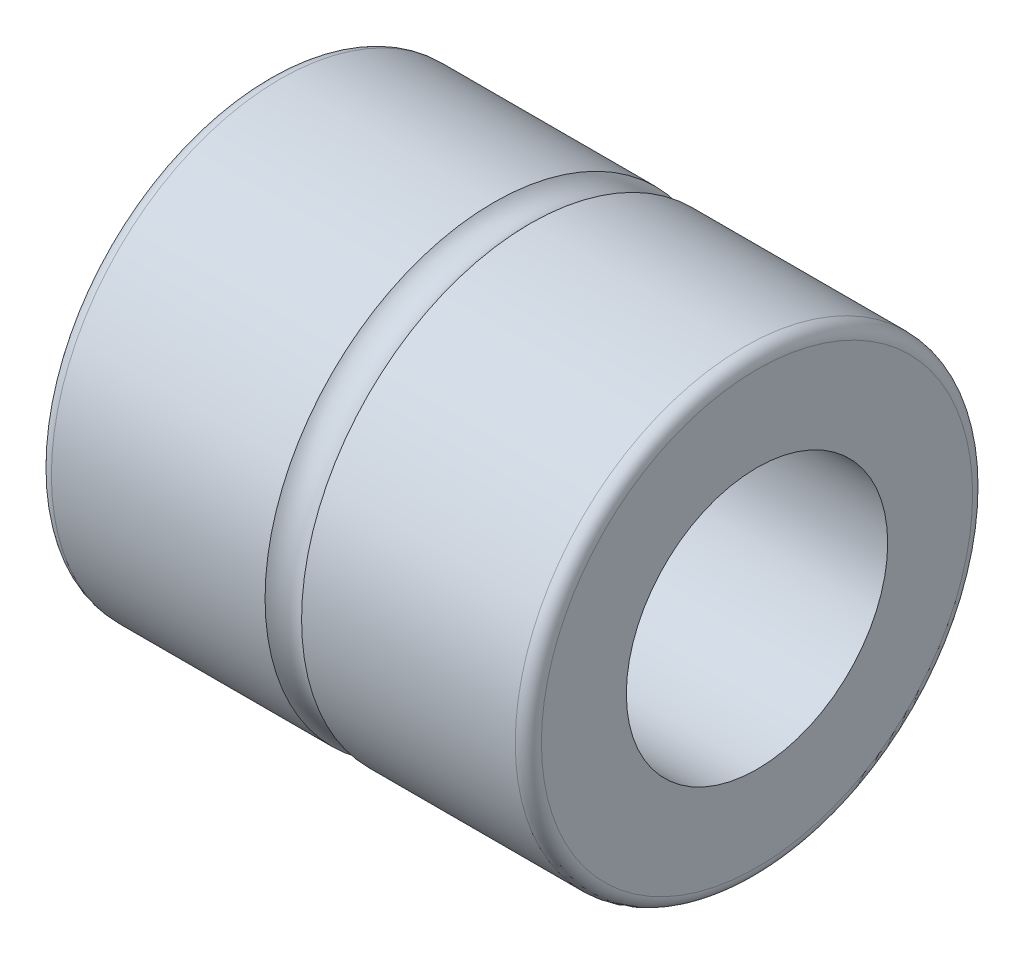
ISO-10303-21;
HEADER;
FILE_DESCRIPTION(('STEP AP214'),'2;1');
FILE_NAME('part.step','',(''),(''),'','','');
FILE_SCHEMA(('AUTOMOTIVE_DESIGN { 1 0 10303 214 1 1 1 1 }'));
ENDSEC;
DATA;
#1=APPLICATION_CONTEXT('core data for automotive mechanical design processes');
#2=APPLICATION_PROTOCOL_DEFINITION('international standard','automotive_design',2000,#1);
#3=PRODUCT_CONTEXT('',#1,'mechanical');
#4=PRODUCT('Part','Part','',(#3));
#5=PRODUCT_RELATED_PRODUCT_CATEGORY('part','',(#4));
#6=PRODUCT_DEFINITION_FORMATION('','',#4);
#7=PRODUCT_DEFINITION_CONTEXT('part definition',#1,'design');
#8=PRODUCT_DEFINITION('design','',#6,#7);
#9=PRODUCT_DEFINITION_SHAPE('','',#8);
#10=(LENGTH_UNIT() NAMED_UNIT(*) SI_UNIT(.MILLI.,.METRE.));
#11=(NAMED_UNIT(*) PLANE_ANGLE_UNIT() SI_UNIT($,.RADIAN.));
#12=(NAMED_UNIT(*) SI_UNIT($,.STERADIAN.) SOLID_ANGLE_UNIT());
#13=UNCERTAINTY_MEASURE_WITH_UNIT(LENGTH_MEASURE(1.E-05),#10,'distance_accuracy_value','');
#14=(GEOMETRIC_REPRESENTATION_CONTEXT(3) GLOBAL_UNCERTAINTY_ASSIGNED_CONTEXT((#13)) GLOBAL_UNIT_ASSIGNED_CONTEXT((#10,
#11,#12)) REPRESENTATION_CONTEXT('',''));
#15=CARTESIAN_POINT('',(0.,0.,0.));
#16=DIRECTION('',(0.,0.,1.));
#17=DIRECTION('',(1.,0.,0.));
#18=AXIS2_PLACEMENT_3D('',#15,#16,#17);
#19=CARTESIAN_POINT('',(15.,0.,0.));
#20=DIRECTION('',(-1.,0.,0.));
#21=DIRECTION('',(0.,0.,1.));
#22=AXIS2_PLACEMENT_3D('',#19,#20,#21);
#23=TOROIDAL_SURFACE('',#22,15.,1.5);
#24=CARTESIAN_POINT('',(16.1180339887499,0.,0.));
#25=DIRECTION('',(1.,0.,0.));
#26=DIRECTION('',(0.,0.,-1.));
#27=AXIS2_PLACEMENT_3D('',#24,#25,#26);
#28=CIRCLE('',#27,14.);
#29=CARTESIAN_POINT('',(16.1180339887499,0.,-14.));
#30=VERTEX_POINT('',#29);
#31=EDGE_CURVE('E196',#30,#30,#28,.T.);
#32=ORIENTED_EDGE('',*,*,#31,.F.);
#33=EDGE_LOOP('',(#32));
#34=FACE_BOUND('',#33,.T.);
#35=CARTESIAN_POINT('',(13.8819660112501,0.,0.));
#36=DIRECTION('',(1.,0.,0.));
#37=DIRECTION('',(0.,0.,-1.));
#38=AXIS2_PLACEMENT_3D('',#35,#36,#37);
#39=CIRCLE('',#38,14.);
#40=CARTESIAN_POINT('',(13.8819660112501,0.,-14.));
#41=VERTEX_POINT('',#40);
#42=EDGE_CURVE('E189',#41,#41,#39,.F.);
#43=ORIENTED_EDGE('',*,*,#42,.F.);
#44=EDGE_LOOP('',(#43));
#45=FACE_BOUND('',#44,.T.);
#46=ADVANCED_FACE('F15',(#34,#45),#23,.F.);
#47=CARTESIAN_POINT('',(22.6590169943749,0.,0.));
#48=DIRECTION('',(1.,0.,0.));
#49=DIRECTION('',(0.,0.,-1.));
#50=AXIS2_PLACEMENT_3D('',#47,#48,#49);
#51=CYLINDRICAL_SURFACE('',#50,14.);
#52=CARTESIAN_POINT('',(29.2,0.,0.));
#53=DIRECTION('',(-1.,0.,0.));
#54=DIRECTION('',(0.,0.,1.));
#55=AXIS2_PLACEMENT_3D('',#52,#53,#54);
#56=CIRCLE('',#55,14.);
#57=CARTESIAN_POINT('',(29.2,0.,14.));
#58=VERTEX_POINT('',#57);
#59=EDGE_CURVE('E185',#58,#58,#56,.F.);
#60=ORIENTED_EDGE('',*,*,#59,.F.);
#61=EDGE_LOOP('',(#60));
#62=FACE_BOUND('',#61,.T.);
#63=ORIENTED_EDGE('',*,*,#31,.T.);
#64=EDGE_LOOP('',(#63));
#65=FACE_BOUND('',#64,.T.);
#66=ADVANCED_FACE('F201',(#62,#65),#51,.T.);
#67=CARTESIAN_POINT('',(7.34098300562505,0.,0.));
#68=DIRECTION('',(1.,0.,0.));
#69=DIRECTION('',(0.,0.,-1.));
#70=AXIS2_PLACEMENT_3D('',#67,#68,#69);
#71=CYLINDRICAL_SURFACE('',#70,14.);
#72=ORIENTED_EDGE('',*,*,#42,.T.);
#73=EDGE_LOOP('',(#72));
#74=FACE_BOUND('',#73,.T.);
#75=CARTESIAN_POINT('',(0.799999999999995,0.,0.));
#76=DIRECTION('',(-1.,0.,0.));
#77=DIRECTION('',(0.,0.,1.));
#78=AXIS2_PLACEMENT_3D('',#75,#76,#77);
#79=CIRCLE('',#78,14.);
#80=CARTESIAN_POINT('',(0.799999999999995,0.,14.));
#81=VERTEX_POINT('',#80);
#82=EDGE_CURVE('E183',#81,#81,#79,.T.);
#83=ORIENTED_EDGE('',*,*,#82,.F.);
#84=EDGE_LOOP('',(#83));
#85=FACE_BOUND('',#84,.T.);
#86=ADVANCED_FACE('F207',(#74,#85),#71,.T.);
#87=CARTESIAN_POINT('',(29.2,0.,0.));
#88=DIRECTION('',(-1.,0.,0.));
#89=DIRECTION('',(0.,0.,1.));
#90=AXIS2_PLACEMENT_3D('',#87,#88,#89);
#91=TOROIDAL_SURFACE('',#90,13.2,0.800000000000002);
#92=ORIENTED_EDGE('',*,*,#59,.T.);
#93=EDGE_LOOP('',(#92));
#94=FACE_BOUND('',#93,.T.);
#95=CARTESIAN_POINT('',(30.,0.,0.));
#96=DIRECTION('',(-1.,0.,0.));
#97=DIRECTION('',(0.,0.,-1.));
#98=AXIS2_PLACEMENT_3D('',#95,#96,#97);
#99=CIRCLE('',#98,13.2);
#100=CARTESIAN_POINT('',(30.,0.,13.2));
#101=VERTEX_POINT('',#100);
#102=CARTESIAN_POINT('',(30.,0.,-13.2));
#103=VERTEX_POINT('',#102);
#104=EDGE_CURVE('E49',#101,#103,#99,.F.);
#105=ORIENTED_EDGE('',*,*,#104,.F.);
#106=CARTESIAN_POINT('',(30.,0.,0.));
#107=DIRECTION('',(-1.,0.,0.));
#108=DIRECTION('',(0.,0.,1.));
#109=AXIS2_PLACEMENT_3D('',#106,#107,#108);
#110=CIRCLE('',#109,13.2);
#111=CARTESIAN_POINT('',(30.,13.2,0.));
#112=VERTEX_POINT('',#111);
#113=EDGE_CURVE('E117',#112,#101,#110,.F.);
#114=ORIENTED_EDGE('',*,*,#113,.F.);
#115=CARTESIAN_POINT('',(30.,0.,0.));
#116=DIRECTION('',(-1.,0.,0.));
#117=DIRECTION('',(0.,1.,0.));
#118=AXIS2_PLACEMENT_3D('',#115,#116,#117);
#119=CIRCLE('',#118,13.2);
#120=EDGE_CURVE('E52',#103,#112,#119,.F.);
#121=ORIENTED_EDGE('',*,*,#120,.F.);
#122=EDGE_LOOP('',(#105,#114,#121));
#123=FACE_BOUND('',#122,.T.);
#124=ADVANCED_FACE('F90',(#94,#123),#91,.T.);
#125=CARTESIAN_POINT('',(0.799999999999995,0.,0.));
#126=DIRECTION('',(-1.,0.,0.));
#127=DIRECTION('',(0.,0.,1.));
#128=AXIS2_PLACEMENT_3D('',#125,#126,#127);
#129=TOROIDAL_SURFACE('',#128,13.2,0.799999999999995);
#130=ORIENTED_EDGE('',*,*,#82,.T.);
#131=EDGE_LOOP('',(#130));
#132=FACE_BOUND('',#131,.T.);
#133=CARTESIAN_POINT('',(0.,0.,0.));
#134=DIRECTION('',(1.,0.,0.));
#135=DIRECTION('',(0.,0.,-1.));
#136=AXIS2_PLACEMENT_3D('',#133,#134,#135);
#137=CIRCLE('',#136,13.2);
#138=CARTESIAN_POINT('',(0.,13.2,0.));
#139=VERTEX_POINT('',#138);
#140=CARTESIAN_POINT('',(0.,0.,-13.2));
#141=VERTEX_POINT('',#140);
#142=EDGE_CURVE('E61',#139,#141,#137,.F.);
#143=ORIENTED_EDGE('',*,*,#142,.F.);
#144=CARTESIAN_POINT('',(0.,0.,0.));
#145=DIRECTION('',(1.,0.,0.));
#146=DIRECTION('',(0.,1.,0.));
#147=AXIS2_PLACEMENT_3D('',#144,#145,#146);
#148=CIRCLE('',#147,13.2);
#149=CARTESIAN_POINT('',(0.,0.,13.2));
#150=VERTEX_POINT('',#149);
#151=EDGE_CURVE('E56',#150,#139,#148,.F.);
#152=ORIENTED_EDGE('',*,*,#151,.F.);
#153=CARTESIAN_POINT('',(0.,0.,0.));
#154=DIRECTION('',(1.,0.,0.));
#155=DIRECTION('',(0.,0.,1.));
#156=AXIS2_PLACEMENT_3D('',#153,#154,#155);
#157=CIRCLE('',#156,13.2);
#158=EDGE_CURVE('E36',#141,#150,#157,.F.);
#159=ORIENTED_EDGE('',*,*,#158,.F.);
#160=EDGE_LOOP('',(#143,#152,#159));
#161=FACE_BOUND('',#160,.T.);
#162=ADVANCED_FACE('F68',(#132,#161),#129,.T.);
#163=CARTESIAN_POINT('',(30.,6.6,0.));
#164=DIRECTION('',(1.,0.,0.));
#165=DIRECTION('',(0.,0.,-1.));
#166=AXIS2_PLACEMENT_3D('',#163,#164,#165);
#167=PLANE('',#166);
#168=ORIENTED_EDGE('',*,*,#113,.T.);
#169=ORIENTED_EDGE('',*,*,#104,.T.);
#170=ORIENTED_EDGE('',*,*,#120,.T.);
#171=EDGE_LOOP('',(#168,#169,#170));
#172=FACE_BOUND('',#171,.T.);
#173=CARTESIAN_POINT('',(30.,0.,0.));
#174=DIRECTION('',(1.,0.,0.));
#175=DIRECTION('',(0.,0.,-1.));
#176=AXIS2_PLACEMENT_3D('',#173,#174,#175);
#177=CIRCLE('',#176,8.);
#178=CARTESIAN_POINT('',(30.,0.,-8.));
#179=VERTEX_POINT('',#178);
#180=EDGE_CURVE('E27',#179,#179,#177,.F.);
#181=ORIENTED_EDGE('',*,*,#180,.T.);
#182=EDGE_LOOP('',(#181));
#183=FACE_BOUND('',#182,.T.);
#184=ADVANCED_FACE('F89',(#172,#183),#167,.T.);
#185=CARTESIAN_POINT('',(0.,6.6,0.));
#186=DIRECTION('',(-1.,0.,0.));
#187=DIRECTION('',(0.,0.,1.));
#188=AXIS2_PLACEMENT_3D('',#185,#186,#187);
#189=PLANE('',#188);
#190=ORIENTED_EDGE('',*,*,#158,.T.);
#191=ORIENTED_EDGE('',*,*,#151,.T.);
#192=ORIENTED_EDGE('',*,*,#142,.T.);
#193=EDGE_LOOP('',(#190,#191,#192));
#194=FACE_BOUND('',#193,.T.);
#195=CARTESIAN_POINT('',(0.,0.,0.));
#196=DIRECTION('',(1.,0.,0.));
#197=DIRECTION('',(0.,0.,-1.));
#198=AXIS2_PLACEMENT_3D('',#195,#196,#197);
#199=CIRCLE('',#198,8.);
#200=CARTESIAN_POINT('',(0.,0.,-8.));
#201=VERTEX_POINT('',#200);
#202=EDGE_CURVE('E10',#201,#201,#199,.T.);
#203=ORIENTED_EDGE('',*,*,#202,.T.);
#204=EDGE_LOOP('',(#203));
#205=FACE_BOUND('',#204,.T.);
#206=ADVANCED_FACE('F59',(#194,#205),#189,.T.);
#207=CARTESIAN_POINT('',(15.,0.,0.));
#208=DIRECTION('',(1.,0.,0.));
#209=DIRECTION('',(0.,0.,-1.));
#210=AXIS2_PLACEMENT_3D('',#207,#208,#209);
#211=CYLINDRICAL_SURFACE('',#210,8.);
#212=ORIENTED_EDGE('',*,*,#202,.F.);
#213=EDGE_LOOP('',(#212));
#214=FACE_BOUND('',#213,.T.);
#215=ORIENTED_EDGE('',*,*,#180,.F.);
#216=EDGE_LOOP('',(#215));
#217=FACE_BOUND('',#216,.T.);
#218=ADVANCED_FACE('F135',(#214,#217),#211,.F.);
#219=CLOSED_SHELL('',(#46,#66,#86,#124,#162,#184,#206,#218));
#220=MANIFOLD_SOLID_BREP('B1',#219);
#221=ADVANCED_BREP_SHAPE_REPRESENTATION('',(#18,#220),#14);
#222=SHAPE_DEFINITION_REPRESENTATION(#9,#221);
ENDSEC;
END-ISO-10303-21;
